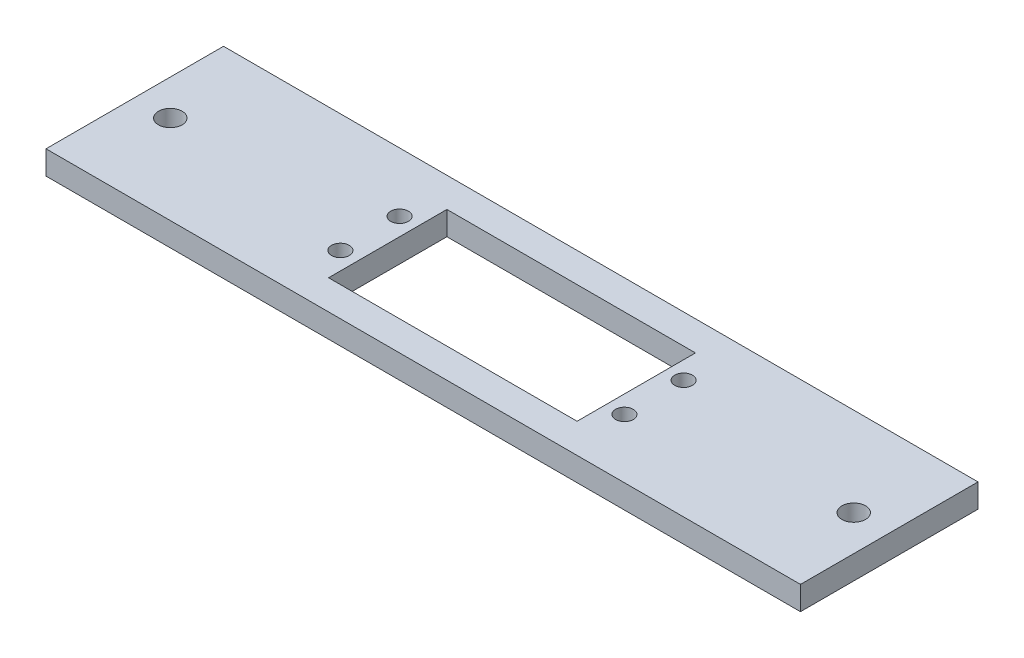
ISO-10303-21;
HEADER;
FILE_DESCRIPTION(('STEP AP214'),'2;1');
FILE_NAME('part.step','',(''),(''),'','','');
FILE_SCHEMA(('AUTOMOTIVE_DESIGN { 1 0 10303 214 1 1 1 1 }'));
ENDSEC;
DATA;
#1=APPLICATION_CONTEXT('core data for automotive mechanical design processes');
#2=APPLICATION_PROTOCOL_DEFINITION('international standard','automotive_design',2000,#1);
#3=PRODUCT_CONTEXT('',#1,'mechanical');
#4=PRODUCT('Part','Part','',(#3));
#5=PRODUCT_RELATED_PRODUCT_CATEGORY('part','',(#4));
#6=PRODUCT_DEFINITION_FORMATION('','',#4);
#7=PRODUCT_DEFINITION_CONTEXT('part definition',#1,'design');
#8=PRODUCT_DEFINITION('design','',#6,#7);
#9=PRODUCT_DEFINITION_SHAPE('','',#8);
#10=(LENGTH_UNIT() NAMED_UNIT(*) SI_UNIT(.MILLI.,.METRE.));
#11=(NAMED_UNIT(*) PLANE_ANGLE_UNIT() SI_UNIT($,.RADIAN.));
#12=(NAMED_UNIT(*) SI_UNIT($,.STERADIAN.) SOLID_ANGLE_UNIT());
#13=UNCERTAINTY_MEASURE_WITH_UNIT(LENGTH_MEASURE(1.E-05),#10,'distance_accuracy_value','');
#14=(GEOMETRIC_REPRESENTATION_CONTEXT(3) GLOBAL_UNCERTAINTY_ASSIGNED_CONTEXT((#13)) GLOBAL_UNIT_ASSIGNED_CONTEXT((#10,
#11,#12)) REPRESENTATION_CONTEXT('',''));
#15=CARTESIAN_POINT('',(0.,0.,0.));
#16=DIRECTION('',(0.,0.,1.));
#17=DIRECTION('',(1.,0.,0.));
#18=AXIS2_PLACEMENT_3D('',#15,#16,#17);
#19=CARTESIAN_POINT('',(0.,4.,0.));
#20=DIRECTION('',(0.,1.,0.));
#21=DIRECTION('',(0.,0.,1.));
#22=AXIS2_PLACEMENT_3D('',#19,#20,#21);
#23=PLANE('',#22);
#24=CARTESIAN_POINT('',(24.,4.,-5.));
#25=DIRECTION('',(0.,1.,0.));
#26=DIRECTION('',(0.,0.,-1.));
#27=AXIS2_PLACEMENT_3D('',#24,#25,#26);
#28=CIRCLE('',#27,1.49999999999999);
#29=CARTESIAN_POINT('',(24.,4.,-6.5));
#30=VERTEX_POINT('',#29);
#31=EDGE_CURVE('E298',#30,#30,#28,.T.);
#32=ORIENTED_EDGE('',*,*,#31,.F.);
#33=EDGE_LOOP('',(#32));
#34=FACE_BOUND('',#33,.T.);
#35=CARTESIAN_POINT('',(24.,4.,4.99999999999999));
#36=DIRECTION('',(0.,1.,0.));
#37=DIRECTION('',(0.,0.,1.));
#38=AXIS2_PLACEMENT_3D('',#35,#36,#37);
#39=CIRCLE('',#38,1.5);
#40=CARTESIAN_POINT('',(24.,4.,6.49999999999999));
#41=VERTEX_POINT('',#40);
#42=EDGE_CURVE('E288',#41,#41,#39,.T.);
#43=ORIENTED_EDGE('',*,*,#42,.F.);
#44=EDGE_LOOP('',(#43));
#45=FACE_BOUND('',#44,.T.);
#46=CARTESIAN_POINT('',(-24.,4.,5.));
#47=DIRECTION('',(0.,1.,0.));
#48=DIRECTION('',(0.,0.,-1.));
#49=AXIS2_PLACEMENT_3D('',#46,#47,#48);
#50=CIRCLE('',#49,1.5);
#51=CARTESIAN_POINT('',(-24.,4.,3.5));
#52=VERTEX_POINT('',#51);
#53=EDGE_CURVE('E278',#52,#52,#50,.T.);
#54=ORIENTED_EDGE('',*,*,#53,.F.);
#55=EDGE_LOOP('',(#54));
#56=FACE_BOUND('',#55,.T.);
#57=CARTESIAN_POINT('',(-24.,4.,-5.));
#58=DIRECTION('',(0.,1.,0.));
#59=DIRECTION('',(0.,0.,1.));
#60=AXIS2_PLACEMENT_3D('',#57,#58,#59);
#61=CIRCLE('',#60,1.5);
#62=CARTESIAN_POINT('',(-24.,4.,-3.5));
#63=VERTEX_POINT('',#62);
#64=EDGE_CURVE('E285',#63,#63,#61,.T.);
#65=ORIENTED_EDGE('',*,*,#64,.F.);
#66=EDGE_LOOP('',(#65));
#67=FACE_BOUND('',#66,.T.);
#68=CARTESIAN_POINT('',(-57.75,4.,0.));
#69=DIRECTION('',(0.,1.,0.));
#70=DIRECTION('',(0.,0.,1.));
#71=AXIS2_PLACEMENT_3D('',#68,#69,#70);
#72=CIRCLE('',#71,2.);
#73=CARTESIAN_POINT('',(-57.75,4.,2.));
#74=VERTEX_POINT('',#73);
#75=EDGE_CURVE('E140',#74,#74,#72,.T.);
#76=ORIENTED_EDGE('',*,*,#75,.F.);
#77=EDGE_LOOP('',(#76));
#78=FACE_BOUND('',#77,.T.);
#79=DIRECTION('',(0.,0.,1.));
#80=VECTOR('',#79,1.);
#81=CARTESIAN_POINT('',(-63.75,4.,-15.));
#82=LINE('',#81,#80);
#83=CARTESIAN_POINT('',(-63.75,4.,-15.));
#84=VERTEX_POINT('',#83);
#85=CARTESIAN_POINT('',(-63.75,4.,15.));
#86=VERTEX_POINT('',#85);
#87=EDGE_CURVE('E156',#84,#86,#82,.T.);
#88=ORIENTED_EDGE('',*,*,#87,.T.);
#89=DIRECTION('',(1.,0.,0.));
#90=VECTOR('',#89,1.);
#91=CARTESIAN_POINT('',(-63.75,4.,15.));
#92=LINE('',#91,#90);
#93=CARTESIAN_POINT('',(63.75,4.,15.));
#94=VERTEX_POINT('',#93);
#95=EDGE_CURVE('E160',#86,#94,#92,.T.);
#96=ORIENTED_EDGE('',*,*,#95,.T.);
#97=DIRECTION('',(0.,0.,-1.));
#98=VECTOR('',#97,1.);
#99=CARTESIAN_POINT('',(63.75,4.,-15.));
#100=LINE('',#99,#98);
#101=CARTESIAN_POINT('',(63.75,4.,-15.));
#102=VERTEX_POINT('',#101);
#103=EDGE_CURVE('E164',#94,#102,#100,.T.);
#104=ORIENTED_EDGE('',*,*,#103,.T.);
#105=DIRECTION('',(-1.,0.,0.));
#106=VECTOR('',#105,1.);
#107=CARTESIAN_POINT('',(-63.75,4.,-15.));
#108=LINE('',#107,#106);
#109=EDGE_CURVE('E167',#102,#84,#108,.T.);
#110=ORIENTED_EDGE('',*,*,#109,.T.);
#111=EDGE_LOOP('',(#88,#96,#104,#110));
#112=FACE_BOUND('',#111,.T.);
#113=DIRECTION('',(-1.,0.,0.));
#114=VECTOR('',#113,1.);
#115=CARTESIAN_POINT('',(-21.,4.,-10.));
#116=LINE('',#115,#114);
#117=CARTESIAN_POINT('',(21.,4.,-10.));
#118=VERTEX_POINT('',#117);
#119=CARTESIAN_POINT('',(-21.,4.,-10.));
#120=VERTEX_POINT('',#119);
#121=EDGE_CURVE('E114',#118,#120,#116,.T.);
#122=ORIENTED_EDGE('',*,*,#121,.F.);
#123=DIRECTION('',(0.,0.,-1.));
#124=VECTOR('',#123,1.);
#125=CARTESIAN_POINT('',(21.,4.,10.));
#126=LINE('',#125,#124);
#127=CARTESIAN_POINT('',(21.,4.,10.));
#128=VERTEX_POINT('',#127);
#129=EDGE_CURVE('E105',#128,#118,#126,.T.);
#130=ORIENTED_EDGE('',*,*,#129,.F.);
#131=DIRECTION('',(1.,0.,0.));
#132=VECTOR('',#131,1.);
#133=CARTESIAN_POINT('',(-21.,4.,10.));
#134=LINE('',#133,#132);
#135=CARTESIAN_POINT('',(-21.,4.,10.));
#136=VERTEX_POINT('',#135);
#137=EDGE_CURVE('E132',#136,#128,#134,.T.);
#138=ORIENTED_EDGE('',*,*,#137,.F.);
#139=DIRECTION('',(0.,0.,1.));
#140=VECTOR('',#139,1.);
#141=CARTESIAN_POINT('',(-21.,4.,10.));
#142=LINE('',#141,#140);
#143=EDGE_CURVE('E128',#120,#136,#142,.T.);
#144=ORIENTED_EDGE('',*,*,#143,.F.);
#145=EDGE_LOOP('',(#122,#130,#138,#144));
#146=FACE_BOUND('',#145,.T.);
#147=CARTESIAN_POINT('',(57.75,4.,0.));
#148=DIRECTION('',(0.,1.,0.));
#149=DIRECTION('',(0.,0.,-1.));
#150=AXIS2_PLACEMENT_3D('',#147,#148,#149);
#151=CIRCLE('',#150,2.00000000000002);
#152=CARTESIAN_POINT('',(57.75,4.,-2.00000000000003));
#153=VERTEX_POINT('',#152);
#154=EDGE_CURVE('E310',#153,#153,#151,.T.);
#155=ORIENTED_EDGE('',*,*,#154,.F.);
#156=EDGE_LOOP('',(#155));
#157=FACE_BOUND('',#156,.T.);
#158=ADVANCED_FACE('F39',(#34,#45,#56,#67,#78,#112,#146,#157),#23,.T.);
#159=CARTESIAN_POINT('',(0.,0.,0.));
#160=DIRECTION('',(0.,1.,0.));
#161=DIRECTION('',(0.,0.,1.));
#162=AXIS2_PLACEMENT_3D('',#159,#160,#161);
#163=PLANE('',#162);
#164=CARTESIAN_POINT('',(24.,0.,-5.));
#165=DIRECTION('',(0.,1.,0.));
#166=DIRECTION('',(0.,0.,-1.));
#167=AXIS2_PLACEMENT_3D('',#164,#165,#166);
#168=CIRCLE('',#167,1.49999999999999);
#169=CARTESIAN_POINT('',(24.,0.,-6.5));
#170=VERTEX_POINT('',#169);
#171=EDGE_CURVE('E294',#170,#170,#168,.T.);
#172=ORIENTED_EDGE('',*,*,#171,.T.);
#173=EDGE_LOOP('',(#172));
#174=FACE_BOUND('',#173,.T.);
#175=CARTESIAN_POINT('',(24.,0.,4.99999999999999));
#176=DIRECTION('',(0.,1.,0.));
#177=DIRECTION('',(0.,0.,1.));
#178=AXIS2_PLACEMENT_3D('',#175,#176,#177);
#179=CIRCLE('',#178,1.5);
#180=CARTESIAN_POINT('',(24.,0.,6.49999999999999));
#181=VERTEX_POINT('',#180);
#182=EDGE_CURVE('E281',#181,#181,#179,.T.);
#183=ORIENTED_EDGE('',*,*,#182,.T.);
#184=EDGE_LOOP('',(#183));
#185=FACE_BOUND('',#184,.T.);
#186=CARTESIAN_POINT('',(-24.,0.,5.));
#187=DIRECTION('',(0.,1.,0.));
#188=DIRECTION('',(0.,0.,-1.));
#189=AXIS2_PLACEMENT_3D('',#186,#187,#188);
#190=CIRCLE('',#189,1.5);
#191=CARTESIAN_POINT('',(-24.,0.,3.5));
#192=VERTEX_POINT('',#191);
#193=EDGE_CURVE('E275',#192,#192,#190,.T.);
#194=ORIENTED_EDGE('',*,*,#193,.T.);
#195=EDGE_LOOP('',(#194));
#196=FACE_BOUND('',#195,.T.);
#197=CARTESIAN_POINT('',(-24.,0.,-5.));
#198=DIRECTION('',(0.,1.,0.));
#199=DIRECTION('',(0.,0.,1.));
#200=AXIS2_PLACEMENT_3D('',#197,#198,#199);
#201=CIRCLE('',#200,1.5);
#202=CARTESIAN_POINT('',(-24.,0.,-3.5));
#203=VERTEX_POINT('',#202);
#204=EDGE_CURVE('E302',#203,#203,#201,.T.);
#205=ORIENTED_EDGE('',*,*,#204,.T.);
#206=EDGE_LOOP('',(#205));
#207=FACE_BOUND('',#206,.T.);
#208=DIRECTION('',(0.,0.,1.));
#209=VECTOR('',#208,1.);
#210=CARTESIAN_POINT('',(-63.75,0.,-15.));
#211=LINE('',#210,#209);
#212=CARTESIAN_POINT('',(-63.75,0.,-15.));
#213=VERTEX_POINT('',#212);
#214=CARTESIAN_POINT('',(-63.75,0.,15.));
#215=VERTEX_POINT('',#214);
#216=EDGE_CURVE('E123',#213,#215,#211,.T.);
#217=ORIENTED_EDGE('',*,*,#216,.F.);
#218=DIRECTION('',(-1.,0.,0.));
#219=VECTOR('',#218,1.);
#220=CARTESIAN_POINT('',(-63.75,0.,-15.));
#221=LINE('',#220,#219);
#222=CARTESIAN_POINT('',(63.75,0.,-15.));
#223=VERTEX_POINT('',#222);
#224=EDGE_CURVE('E161',#223,#213,#221,.T.);
#225=ORIENTED_EDGE('',*,*,#224,.F.);
#226=DIRECTION('',(0.,0.,-1.));
#227=VECTOR('',#226,1.);
#228=CARTESIAN_POINT('',(63.75,0.,-15.));
#229=LINE('',#228,#227);
#230=CARTESIAN_POINT('',(63.75,0.,15.));
#231=VERTEX_POINT('',#230);
#232=EDGE_CURVE('E177',#231,#223,#229,.T.);
#233=ORIENTED_EDGE('',*,*,#232,.F.);
#234=DIRECTION('',(1.,0.,0.));
#235=VECTOR('',#234,1.);
#236=CARTESIAN_POINT('',(-63.75,0.,15.));
#237=LINE('',#236,#235);
#238=EDGE_CURVE('E174',#215,#231,#237,.T.);
#239=ORIENTED_EDGE('',*,*,#238,.F.);
#240=EDGE_LOOP('',(#217,#225,#233,#239));
#241=FACE_BOUND('',#240,.T.);
#242=DIRECTION('',(0.,0.,-1.));
#243=VECTOR('',#242,1.);
#244=CARTESIAN_POINT('',(21.,0.,10.));
#245=LINE('',#244,#243);
#246=CARTESIAN_POINT('',(21.,0.,10.));
#247=VERTEX_POINT('',#246);
#248=CARTESIAN_POINT('',(21.,0.,-10.));
#249=VERTEX_POINT('',#248);
#250=EDGE_CURVE('E63',#247,#249,#245,.T.);
#251=ORIENTED_EDGE('',*,*,#250,.T.);
#252=DIRECTION('',(-1.,0.,0.));
#253=VECTOR('',#252,1.);
#254=CARTESIAN_POINT('',(-21.,0.,-10.));
#255=LINE('',#254,#253);
#256=CARTESIAN_POINT('',(-21.,0.,-10.));
#257=VERTEX_POINT('',#256);
#258=EDGE_CURVE('E121',#249,#257,#255,.T.);
#259=ORIENTED_EDGE('',*,*,#258,.T.);
#260=DIRECTION('',(0.,0.,1.));
#261=VECTOR('',#260,1.);
#262=CARTESIAN_POINT('',(-21.,0.,10.));
#263=LINE('',#262,#261);
#264=CARTESIAN_POINT('',(-21.,0.,10.));
#265=VERTEX_POINT('',#264);
#266=EDGE_CURVE('E143',#257,#265,#263,.T.);
#267=ORIENTED_EDGE('',*,*,#266,.T.);
#268=DIRECTION('',(1.,0.,0.));
#269=VECTOR('',#268,1.);
#270=CARTESIAN_POINT('',(-21.,0.,10.));
#271=LINE('',#270,#269);
#272=EDGE_CURVE('E115',#265,#247,#271,.T.);
#273=ORIENTED_EDGE('',*,*,#272,.T.);
#274=EDGE_LOOP('',(#251,#259,#267,#273));
#275=FACE_BOUND('',#274,.T.);
#276=CARTESIAN_POINT('',(-57.75,0.,0.));
#277=DIRECTION('',(0.,1.,0.));
#278=DIRECTION('',(0.,0.,1.));
#279=AXIS2_PLACEMENT_3D('',#276,#277,#278);
#280=CIRCLE('',#279,2.);
#281=CARTESIAN_POINT('',(-57.75,0.,2.));
#282=VERTEX_POINT('',#281);
#283=EDGE_CURVE('E314',#282,#282,#280,.T.);
#284=ORIENTED_EDGE('',*,*,#283,.T.);
#285=EDGE_LOOP('',(#284));
#286=FACE_BOUND('',#285,.T.);
#287=CARTESIAN_POINT('',(57.75,0.,0.));
#288=DIRECTION('',(0.,1.,0.));
#289=DIRECTION('',(0.,0.,-1.));
#290=AXIS2_PLACEMENT_3D('',#287,#288,#289);
#291=CIRCLE('',#290,2.00000000000002);
#292=CARTESIAN_POINT('',(57.75,0.,-2.00000000000003));
#293=VERTEX_POINT('',#292);
#294=EDGE_CURVE('E306',#293,#293,#291,.T.);
#295=ORIENTED_EDGE('',*,*,#294,.T.);
#296=EDGE_LOOP('',(#295));
#297=FACE_BOUND('',#296,.T.);
#298=ADVANCED_FACE('F200',(#174,#185,#196,#207,#241,#275,#286,#297),#163,.F.);
#299=CARTESIAN_POINT('',(-63.75,4.,-15.));
#300=DIRECTION('',(1.,0.,0.));
#301=DIRECTION('',(0.,0.,-1.));
#302=AXIS2_PLACEMENT_3D('',#299,#300,#301);
#303=PLANE('',#302);
#304=ORIENTED_EDGE('',*,*,#216,.T.);
#305=DIRECTION('',(0.,-1.,0.));
#306=VECTOR('',#305,1.);
#307=CARTESIAN_POINT('',(-63.75,4.,15.));
#308=LINE('',#307,#306);
#309=EDGE_CURVE('E11',#86,#215,#308,.T.);
#310=ORIENTED_EDGE('',*,*,#309,.F.);
#311=ORIENTED_EDGE('',*,*,#87,.F.);
#312=DIRECTION('',(0.,-1.,0.));
#313=VECTOR('',#312,1.);
#314=CARTESIAN_POINT('',(-63.75,4.,-15.));
#315=LINE('',#314,#313);
#316=EDGE_CURVE('E170',#84,#213,#315,.T.);
#317=ORIENTED_EDGE('',*,*,#316,.T.);
#318=EDGE_LOOP('',(#304,#310,#311,#317));
#319=FACE_BOUND('',#318,.T.);
#320=ADVANCED_FACE('F41',(#319),#303,.F.);
#321=CARTESIAN_POINT('',(-63.75,4.,15.));
#322=DIRECTION('',(0.,0.,-1.));
#323=DIRECTION('',(-1.,0.,0.));
#324=AXIS2_PLACEMENT_3D('',#321,#322,#323);
#325=PLANE('',#324);
#326=ORIENTED_EDGE('',*,*,#238,.T.);
#327=DIRECTION('',(0.,-1.,0.));
#328=VECTOR('',#327,1.);
#329=CARTESIAN_POINT('',(63.75,4.,15.));
#330=LINE('',#329,#328);
#331=EDGE_CURVE('E48',#94,#231,#330,.T.);
#332=ORIENTED_EDGE('',*,*,#331,.F.);
#333=ORIENTED_EDGE('',*,*,#95,.F.);
#334=ORIENTED_EDGE('',*,*,#309,.T.);
#335=EDGE_LOOP('',(#326,#332,#333,#334));
#336=FACE_BOUND('',#335,.T.);
#337=ADVANCED_FACE('F210',(#336),#325,.F.);
#338=CARTESIAN_POINT('',(63.75,4.,-15.));
#339=DIRECTION('',(-1.,0.,0.));
#340=DIRECTION('',(0.,0.,1.));
#341=AXIS2_PLACEMENT_3D('',#338,#339,#340);
#342=PLANE('',#341);
#343=ORIENTED_EDGE('',*,*,#232,.T.);
#344=DIRECTION('',(0.,-1.,0.));
#345=VECTOR('',#344,1.);
#346=CARTESIAN_POINT('',(63.75,4.,-15.));
#347=LINE('',#346,#345);
#348=EDGE_CURVE('E185',#102,#223,#347,.T.);
#349=ORIENTED_EDGE('',*,*,#348,.F.);
#350=ORIENTED_EDGE('',*,*,#103,.F.);
#351=ORIENTED_EDGE('',*,*,#331,.T.);
#352=EDGE_LOOP('',(#343,#349,#350,#351));
#353=FACE_BOUND('',#352,.T.);
#354=ADVANCED_FACE('F194',(#353),#342,.F.);
#355=CARTESIAN_POINT('',(-63.75,4.,-15.));
#356=DIRECTION('',(0.,0.,1.));
#357=DIRECTION('',(1.,0.,0.));
#358=AXIS2_PLACEMENT_3D('',#355,#356,#357);
#359=PLANE('',#358);
#360=ORIENTED_EDGE('',*,*,#224,.T.);
#361=ORIENTED_EDGE('',*,*,#316,.F.);
#362=ORIENTED_EDGE('',*,*,#109,.F.);
#363=ORIENTED_EDGE('',*,*,#348,.T.);
#364=EDGE_LOOP('',(#360,#361,#362,#363));
#365=FACE_BOUND('',#364,.T.);
#366=ADVANCED_FACE('F204',(#365),#359,.F.);
#367=CARTESIAN_POINT('',(21.,4.,10.));
#368=DIRECTION('',(-1.,0.,0.));
#369=DIRECTION('',(0.,0.,1.));
#370=AXIS2_PLACEMENT_3D('',#367,#368,#369);
#371=PLANE('',#370);
#372=ORIENTED_EDGE('',*,*,#250,.F.);
#373=DIRECTION('',(0.,-1.,0.));
#374=VECTOR('',#373,1.);
#375=CARTESIAN_POINT('',(21.,4.,10.));
#376=LINE('',#375,#374);
#377=EDGE_CURVE('E109',#128,#247,#376,.T.);
#378=ORIENTED_EDGE('',*,*,#377,.F.);
#379=ORIENTED_EDGE('',*,*,#129,.T.);
#380=DIRECTION('',(0.,-1.,0.));
#381=VECTOR('',#380,1.);
#382=CARTESIAN_POINT('',(21.,4.,-10.));
#383=LINE('',#382,#381);
#384=EDGE_CURVE('E108',#118,#249,#383,.T.);
#385=ORIENTED_EDGE('',*,*,#384,.T.);
#386=EDGE_LOOP('',(#372,#378,#379,#385));
#387=FACE_BOUND('',#386,.T.);
#388=ADVANCED_FACE('F107',(#387),#371,.T.);
#389=CARTESIAN_POINT('',(-21.,4.,-10.));
#390=DIRECTION('',(0.,0.,1.));
#391=DIRECTION('',(1.,0.,0.));
#392=AXIS2_PLACEMENT_3D('',#389,#390,#391);
#393=PLANE('',#392);
#394=ORIENTED_EDGE('',*,*,#258,.F.);
#395=ORIENTED_EDGE('',*,*,#384,.F.);
#396=ORIENTED_EDGE('',*,*,#121,.T.);
#397=DIRECTION('',(0.,-1.,0.));
#398=VECTOR('',#397,1.);
#399=CARTESIAN_POINT('',(-21.,4.,-10.));
#400=LINE('',#399,#398);
#401=EDGE_CURVE('E124',#120,#257,#400,.T.);
#402=ORIENTED_EDGE('',*,*,#401,.T.);
#403=EDGE_LOOP('',(#394,#395,#396,#402));
#404=FACE_BOUND('',#403,.T.);
#405=ADVANCED_FACE('F118',(#404),#393,.T.);
#406=CARTESIAN_POINT('',(-21.,4.,10.));
#407=DIRECTION('',(1.,0.,0.));
#408=DIRECTION('',(0.,0.,-1.));
#409=AXIS2_PLACEMENT_3D('',#406,#407,#408);
#410=PLANE('',#409);
#411=ORIENTED_EDGE('',*,*,#266,.F.);
#412=ORIENTED_EDGE('',*,*,#401,.F.);
#413=ORIENTED_EDGE('',*,*,#143,.T.);
#414=DIRECTION('',(0.,-1.,0.));
#415=VECTOR('',#414,1.);
#416=CARTESIAN_POINT('',(-21.,4.,10.));
#417=LINE('',#416,#415);
#418=EDGE_CURVE('E55',#136,#265,#417,.T.);
#419=ORIENTED_EDGE('',*,*,#418,.T.);
#420=EDGE_LOOP('',(#411,#412,#413,#419));
#421=FACE_BOUND('',#420,.T.);
#422=ADVANCED_FACE('F237',(#421),#410,.T.);
#423=CARTESIAN_POINT('',(-21.,4.,10.));
#424=DIRECTION('',(0.,0.,-1.));
#425=DIRECTION('',(-1.,0.,0.));
#426=AXIS2_PLACEMENT_3D('',#423,#424,#425);
#427=PLANE('',#426);
#428=ORIENTED_EDGE('',*,*,#272,.F.);
#429=ORIENTED_EDGE('',*,*,#418,.F.);
#430=ORIENTED_EDGE('',*,*,#137,.T.);
#431=ORIENTED_EDGE('',*,*,#377,.T.);
#432=EDGE_LOOP('',(#428,#429,#430,#431));
#433=FACE_BOUND('',#432,.T.);
#434=ADVANCED_FACE('F241',(#433),#427,.T.);
#435=CARTESIAN_POINT('',(-57.75,4.,0.));
#436=DIRECTION('',(0.,-1.,0.));
#437=DIRECTION('',(0.,0.,-1.));
#438=AXIS2_PLACEMENT_3D('',#435,#436,#437);
#439=CYLINDRICAL_SURFACE('',#438,2.);
#440=ORIENTED_EDGE('',*,*,#75,.T.);
#441=EDGE_LOOP('',(#440));
#442=FACE_BOUND('',#441,.T.);
#443=ORIENTED_EDGE('',*,*,#283,.F.);
#444=EDGE_LOOP('',(#443));
#445=FACE_BOUND('',#444,.T.);
#446=ADVANCED_FACE('F247',(#442,#445),#439,.F.);
#447=CARTESIAN_POINT('',(57.75,4.,0.));
#448=DIRECTION('',(0.,-1.,0.));
#449=DIRECTION('',(0.,0.,-1.));
#450=AXIS2_PLACEMENT_3D('',#447,#448,#449);
#451=CYLINDRICAL_SURFACE('',#450,2.00000000000002);
#452=ORIENTED_EDGE('',*,*,#154,.T.);
#453=EDGE_LOOP('',(#452));
#454=FACE_BOUND('',#453,.T.);
#455=ORIENTED_EDGE('',*,*,#294,.F.);
#456=EDGE_LOOP('',(#455));
#457=FACE_BOUND('',#456,.T.);
#458=ADVANCED_FACE('F250',(#454,#457),#451,.F.);
#459=CARTESIAN_POINT('',(-24.,0.,-5.));
#460=DIRECTION('',(0.,1.,0.));
#461=DIRECTION('',(0.,0.,1.));
#462=AXIS2_PLACEMENT_3D('',#459,#460,#461);
#463=CYLINDRICAL_SURFACE('',#462,1.5);
#464=ORIENTED_EDGE('',*,*,#204,.F.);
#465=EDGE_LOOP('',(#464));
#466=FACE_BOUND('',#465,.T.);
#467=ORIENTED_EDGE('',*,*,#64,.T.);
#468=EDGE_LOOP('',(#467));
#469=FACE_BOUND('',#468,.T.);
#470=ADVANCED_FACE('F254',(#466,#469),#463,.F.);
#471=CARTESIAN_POINT('',(-24.,0.,5.));
#472=DIRECTION('',(0.,1.,0.));
#473=DIRECTION('',(0.,0.,1.));
#474=AXIS2_PLACEMENT_3D('',#471,#472,#473);
#475=CYLINDRICAL_SURFACE('',#474,1.5);
#476=ORIENTED_EDGE('',*,*,#193,.F.);
#477=EDGE_LOOP('',(#476));
#478=FACE_BOUND('',#477,.T.);
#479=ORIENTED_EDGE('',*,*,#53,.T.);
#480=EDGE_LOOP('',(#479));
#481=FACE_BOUND('',#480,.T.);
#482=ADVANCED_FACE('F258',(#478,#481),#475,.F.);
#483=CARTESIAN_POINT('',(24.,0.,4.99999999999999));
#484=DIRECTION('',(0.,1.,0.));
#485=DIRECTION('',(0.,0.,1.));
#486=AXIS2_PLACEMENT_3D('',#483,#484,#485);
#487=CYLINDRICAL_SURFACE('',#486,1.5);
#488=ORIENTED_EDGE('',*,*,#182,.F.);
#489=EDGE_LOOP('',(#488));
#490=FACE_BOUND('',#489,.T.);
#491=ORIENTED_EDGE('',*,*,#42,.T.);
#492=EDGE_LOOP('',(#491));
#493=FACE_BOUND('',#492,.T.);
#494=ADVANCED_FACE('F263',(#490,#493),#487,.F.);
#495=CARTESIAN_POINT('',(24.,0.,-5.));
#496=DIRECTION('',(0.,1.,0.));
#497=DIRECTION('',(0.,0.,1.));
#498=AXIS2_PLACEMENT_3D('',#495,#496,#497);
#499=CYLINDRICAL_SURFACE('',#498,1.49999999999999);
#500=ORIENTED_EDGE('',*,*,#171,.F.);
#501=EDGE_LOOP('',(#500));
#502=FACE_BOUND('',#501,.T.);
#503=ORIENTED_EDGE('',*,*,#31,.T.);
#504=EDGE_LOOP('',(#503));
#505=FACE_BOUND('',#504,.T.);
#506=ADVANCED_FACE('F260',(#502,#505),#499,.F.);
#507=CLOSED_SHELL('',(#158,#298,#320,#337,#354,#366,#388,#405,#422,#434,#446,#458,#470,#482,
#494,#506));
#508=MANIFOLD_SOLID_BREP('B2',#507);
#509=ADVANCED_BREP_SHAPE_REPRESENTATION('',(#18,#508),#14);
#510=SHAPE_DEFINITION_REPRESENTATION(#9,#509);
ENDSEC;
END-ISO-10303-21;
